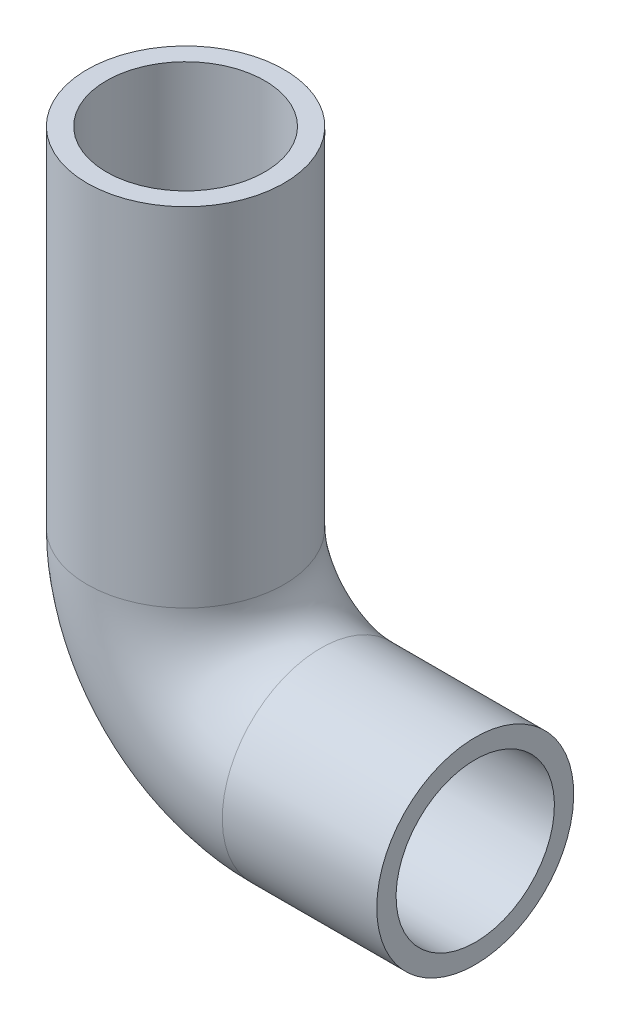
ISO-10303-21;
HEADER;
FILE_DESCRIPTION(('STEP AP214'),'2;1');
FILE_NAME('part.step','',(''),(''),'','','');
FILE_SCHEMA(('AUTOMOTIVE_DESIGN { 1 0 10303 214 1 1 1 1 }'));
ENDSEC;
DATA;
#1=APPLICATION_CONTEXT('core data for automotive mechanical design processes');
#2=APPLICATION_PROTOCOL_DEFINITION('international standard','automotive_design',2000,#1);
#3=PRODUCT_CONTEXT('',#1,'mechanical');
#4=PRODUCT('Part','Part','',(#3));
#5=PRODUCT_RELATED_PRODUCT_CATEGORY('part','',(#4));
#6=PRODUCT_DEFINITION_FORMATION('','',#4);
#7=PRODUCT_DEFINITION_CONTEXT('part definition',#1,'design');
#8=PRODUCT_DEFINITION('design','',#6,#7);
#9=PRODUCT_DEFINITION_SHAPE('','',#8);
#10=(LENGTH_UNIT() NAMED_UNIT(*) SI_UNIT(.MILLI.,.METRE.));
#11=(NAMED_UNIT(*) PLANE_ANGLE_UNIT() SI_UNIT($,.RADIAN.));
#12=(NAMED_UNIT(*) SI_UNIT($,.STERADIAN.) SOLID_ANGLE_UNIT());
#13=UNCERTAINTY_MEASURE_WITH_UNIT(LENGTH_MEASURE(1.E-05),#10,'distance_accuracy_value','');
#14=(GEOMETRIC_REPRESENTATION_CONTEXT(3) GLOBAL_UNCERTAINTY_ASSIGNED_CONTEXT((#13)) GLOBAL_UNIT_ASSIGNED_CONTEXT((#10,
#11,#12)) REPRESENTATION_CONTEXT('',''));
#15=CARTESIAN_POINT('',(0.,0.,0.));
#16=DIRECTION('',(0.,0.,1.));
#17=DIRECTION('',(1.,0.,0.));
#18=AXIS2_PLACEMENT_3D('',#15,#16,#17);
#19=CARTESIAN_POINT('',(0.,250.,0.));
#20=DIRECTION('',(0.,1.,0.));
#21=DIRECTION('',(0.,0.,1.));
#22=AXIS2_PLACEMENT_3D('',#19,#20,#21);
#23=PLANE('',#22);
#24=CARTESIAN_POINT('',(0.,250.,0.));
#25=DIRECTION('',(0.,1.,0.));
#26=DIRECTION('',(0.,0.,1.));
#27=AXIS2_PLACEMENT_3D('',#24,#25,#26);
#28=CIRCLE('',#27,41.);
#29=CARTESIAN_POINT('',(0.,250.,41.));
#30=VERTEX_POINT('',#29);
#31=EDGE_CURVE('E91',#30,#30,#28,.T.);
#32=ORIENTED_EDGE('',*,*,#31,.F.);
#33=EDGE_LOOP('',(#32));
#34=FACE_BOUND('',#33,.T.);
#35=CARTESIAN_POINT('',(0.,250.,0.));
#36=DIRECTION('',(0.,1.,0.));
#37=DIRECTION('',(0.,0.,1.));
#38=AXIS2_PLACEMENT_3D('',#35,#36,#37);
#39=CIRCLE('',#38,51.);
#40=CARTESIAN_POINT('',(0.,250.,51.));
#41=VERTEX_POINT('',#40);
#42=EDGE_CURVE('E44',#41,#41,#39,.T.);
#43=ORIENTED_EDGE('',*,*,#42,.T.);
#44=EDGE_LOOP('',(#43));
#45=FACE_BOUND('',#44,.T.);
#46=ADVANCED_FACE('F32',(#34,#45),#23,.T.);
#47=CARTESIAN_POINT('',(150.,0.,0.));
#48=DIRECTION('',(-1.,0.,0.));
#49=DIRECTION('',(0.,0.,1.));
#50=AXIS2_PLACEMENT_3D('',#47,#48,#49);
#51=PLANE('',#50);
#52=CARTESIAN_POINT('',(150.,0.,0.));
#53=DIRECTION('',(-1.,0.,0.));
#54=DIRECTION('',(0.,-1.,0.));
#55=AXIS2_PLACEMENT_3D('',#52,#53,#54);
#56=CIRCLE('',#55,41.);
#57=CARTESIAN_POINT('',(150.,-41.,0.));
#58=VERTEX_POINT('',#57);
#59=EDGE_CURVE('E93',#58,#58,#56,.T.);
#60=ORIENTED_EDGE('',*,*,#59,.T.);
#61=EDGE_LOOP('',(#60));
#62=FACE_BOUND('',#61,.T.);
#63=CARTESIAN_POINT('',(150.,0.,0.));
#64=DIRECTION('',(-1.,0.,0.));
#65=DIRECTION('',(0.,0.,1.));
#66=AXIS2_PLACEMENT_3D('',#63,#64,#65);
#67=CIRCLE('',#66,51.);
#68=CARTESIAN_POINT('',(150.,0.,51.));
#69=VERTEX_POINT('',#68);
#70=EDGE_CURVE('E11',#69,#69,#67,.T.);
#71=ORIENTED_EDGE('',*,*,#70,.F.);
#72=EDGE_LOOP('',(#71));
#73=FACE_BOUND('',#72,.T.);
#74=ADVANCED_FACE('F50',(#62,#73),#51,.F.);
#75=CARTESIAN_POINT('',(0.,250.,0.));
#76=DIRECTION('',(0.,-1.,0.));
#77=DIRECTION('',(1.,0.,0.));
#78=AXIS2_PLACEMENT_3D('',#75,#76,#77);
#79=CYLINDRICAL_SURFACE('',#78,51.);
#80=CARTESIAN_POINT('',(0.,70.0000000000001,0.));
#81=DIRECTION('',(0.,1.,0.));
#82=DIRECTION('',(0.,0.,1.));
#83=AXIS2_PLACEMENT_3D('',#80,#81,#82);
#84=CIRCLE('',#83,51.);
#85=CARTESIAN_POINT('',(-51.,70.0000000000001,0.));
#86=VERTEX_POINT('',#85);
#87=EDGE_CURVE('E100',#86,#86,#84,.T.);
#88=ORIENTED_EDGE('',*,*,#87,.T.);
#89=EDGE_LOOP('',(#88));
#90=FACE_BOUND('',#89,.T.);
#91=ORIENTED_EDGE('',*,*,#42,.F.);
#92=EDGE_LOOP('',(#91));
#93=FACE_BOUND('',#92,.T.);
#94=ADVANCED_FACE('F52',(#90,#93),#79,.T.);
#95=CARTESIAN_POINT('',(70.,70.,0.));
#96=DIRECTION('',(0.,0.,1.));
#97=DIRECTION('',(1.,0.,0.));
#98=AXIS2_PLACEMENT_3D('',#95,#96,#97);
#99=TOROIDAL_SURFACE('',#98,70.,51.);
#100=CARTESIAN_POINT('',(70.0000000000001,0.,0.));
#101=DIRECTION('',(-1.,0.,0.));
#102=DIRECTION('',(0.,0.,1.));
#103=AXIS2_PLACEMENT_3D('',#100,#101,#102);
#104=CIRCLE('',#103,51.);
#105=CARTESIAN_POINT('',(70.0000000000001,-51.,0.));
#106=VERTEX_POINT('',#105);
#107=EDGE_CURVE('E39',#106,#106,#104,.T.);
#108=CARTESIAN_POINT('',(70.,70.,0.));
#109=DIRECTION('',(0.,0.,1.));
#110=DIRECTION('',(1.,0.,0.));
#111=AXIS2_PLACEMENT_3D('',#108,#109,#110);
#112=CIRCLE('',#111,121.);
#113=EDGE_CURVE('',#86,#106,#112,.T.);
#114=ORIENTED_EDGE('',*,*,#87,.F.);
#115=ORIENTED_EDGE('',*,*,#107,.T.);
#116=ORIENTED_EDGE('',*,*,#113,.T.);
#117=ORIENTED_EDGE('',*,*,#113,.F.);
#118=EDGE_LOOP('',(#114,#116,#115,#117));
#119=FACE_BOUND('',#118,.T.);
#120=ADVANCED_FACE('F58',(#119),#99,.T.);
#121=CARTESIAN_POINT('',(70.0000000000001,0.,0.));
#122=DIRECTION('',(1.,0.,0.));
#123=DIRECTION('',(0.,0.,-1.));
#124=AXIS2_PLACEMENT_3D('',#121,#122,#123);
#125=CYLINDRICAL_SURFACE('',#124,51.);
#126=ORIENTED_EDGE('',*,*,#70,.T.);
#127=EDGE_LOOP('',(#126));
#128=FACE_BOUND('',#127,.T.);
#129=ORIENTED_EDGE('',*,*,#107,.F.);
#130=EDGE_LOOP('',(#129));
#131=FACE_BOUND('',#130,.T.);
#132=ADVANCED_FACE('F47',(#128,#131),#125,.T.);
#133=CARTESIAN_POINT('',(0.,250.,0.));
#134=DIRECTION('',(0.,-1.,0.));
#135=DIRECTION('',(1.,0.,0.));
#136=AXIS2_PLACEMENT_3D('',#133,#134,#135);
#137=CYLINDRICAL_SURFACE('',#136,41.);
#138=CARTESIAN_POINT('',(0.,70.0000000000001,0.));
#139=DIRECTION('',(0.,-1.,0.));
#140=DIRECTION('',(1.,0.,0.));
#141=AXIS2_PLACEMENT_3D('',#138,#139,#140);
#142=CIRCLE('',#141,41.);
#143=CARTESIAN_POINT('',(-41.,70.0000000000002,0.));
#144=VERTEX_POINT('',#143);
#145=EDGE_CURVE('E90',#144,#144,#142,.F.);
#146=ORIENTED_EDGE('',*,*,#145,.F.);
#147=EDGE_LOOP('',(#146));
#148=FACE_BOUND('',#147,.T.);
#149=ORIENTED_EDGE('',*,*,#31,.T.);
#150=EDGE_LOOP('',(#149));
#151=FACE_BOUND('',#150,.T.);
#152=ADVANCED_FACE('F66',(#148,#151),#137,.F.);
#153=CARTESIAN_POINT('',(70.,70.,0.));
#154=DIRECTION('',(0.,0.,1.));
#155=DIRECTION('',(1.,0.,0.));
#156=AXIS2_PLACEMENT_3D('',#153,#154,#155);
#157=TOROIDAL_SURFACE('',#156,70.,41.);
#158=CARTESIAN_POINT('',(70.,0.,0.));
#159=DIRECTION('',(-1.,0.,0.));
#160=DIRECTION('',(0.,-1.,0.));
#161=AXIS2_PLACEMENT_3D('',#158,#159,#160);
#162=CIRCLE('',#161,41.);
#163=CARTESIAN_POINT('',(70.,-41.,0.));
#164=VERTEX_POINT('',#163);
#165=EDGE_CURVE('E87',#164,#164,#162,.T.);
#166=CARTESIAN_POINT('',(70.,70.,0.));
#167=DIRECTION('',(0.,0.,1.));
#168=DIRECTION('',(1.,0.,0.));
#169=AXIS2_PLACEMENT_3D('',#166,#167,#168);
#170=CIRCLE('',#169,111.);
#171=EDGE_CURVE('',#144,#164,#170,.T.);
#172=ORIENTED_EDGE('',*,*,#145,.T.);
#173=ORIENTED_EDGE('',*,*,#165,.F.);
#174=ORIENTED_EDGE('',*,*,#171,.T.);
#175=ORIENTED_EDGE('',*,*,#171,.F.);
#176=EDGE_LOOP('',(#172,#174,#173,#175));
#177=FACE_BOUND('',#176,.T.);
#178=ADVANCED_FACE('F71',(#177),#157,.F.);
#179=CARTESIAN_POINT('',(70.0000000000001,0.,0.));
#180=DIRECTION('',(1.,0.,0.));
#181=DIRECTION('',(0.,0.,-1.));
#182=AXIS2_PLACEMENT_3D('',#179,#180,#181);
#183=CYLINDRICAL_SURFACE('',#182,41.);
#184=ORIENTED_EDGE('',*,*,#59,.F.);
#185=EDGE_LOOP('',(#184));
#186=FACE_BOUND('',#185,.T.);
#187=ORIENTED_EDGE('',*,*,#165,.T.);
#188=EDGE_LOOP('',(#187));
#189=FACE_BOUND('',#188,.T.);
#190=ADVANCED_FACE('F62',(#186,#189),#183,.F.);
#191=CLOSED_SHELL('',(#46,#74,#94,#120,#132,#152,#178,#190));
#192=MANIFOLD_SOLID_BREP('B2',#191);
#193=ADVANCED_BREP_SHAPE_REPRESENTATION('',(#18,#192),#14);
#194=SHAPE_DEFINITION_REPRESENTATION(#9,#193);
ENDSEC;
END-ISO-10303-21;
